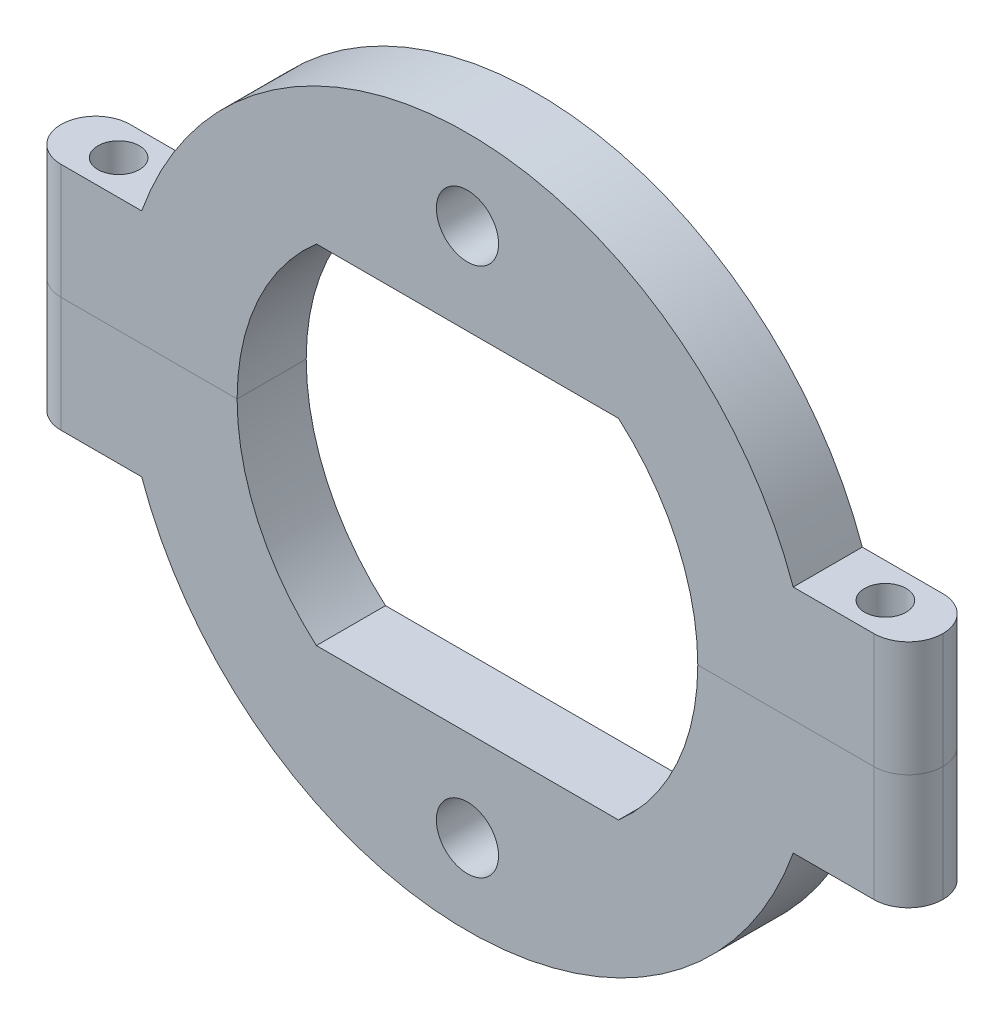
ISO-10303-21;
HEADER;
FILE_DESCRIPTION(('STEP AP214'),'2;1');
FILE_NAME('part.step','',(''),(''),'','','');
FILE_SCHEMA(('AUTOMOTIVE_DESIGN { 1 0 10303 214 1 1 1 1 }'));
ENDSEC;
DATA;
#1=APPLICATION_CONTEXT('core data for automotive mechanical design processes');
#2=APPLICATION_PROTOCOL_DEFINITION('international standard','automotive_design',2000,#1);
#3=PRODUCT_CONTEXT('',#1,'mechanical');
#4=PRODUCT('Part','Part','',(#3));
#5=PRODUCT_RELATED_PRODUCT_CATEGORY('part','',(#4));
#6=PRODUCT_DEFINITION_FORMATION('','',#4);
#7=PRODUCT_DEFINITION_CONTEXT('part definition',#1,'design');
#8=PRODUCT_DEFINITION('design','',#6,#7);
#9=PRODUCT_DEFINITION_SHAPE('','',#8);
#10=(LENGTH_UNIT() NAMED_UNIT(*) SI_UNIT(.MILLI.,.METRE.));
#11=(NAMED_UNIT(*) PLANE_ANGLE_UNIT() SI_UNIT($,.RADIAN.));
#12=(NAMED_UNIT(*) SI_UNIT($,.STERADIAN.) SOLID_ANGLE_UNIT());
#13=UNCERTAINTY_MEASURE_WITH_UNIT(LENGTH_MEASURE(1.E-05),#10,'distance_accuracy_value','');
#14=(GEOMETRIC_REPRESENTATION_CONTEXT(3) GLOBAL_UNCERTAINTY_ASSIGNED_CONTEXT((#13)) GLOBAL_UNIT_ASSIGNED_CONTEXT((#10,
#11,#12)) REPRESENTATION_CONTEXT('',''));
#15=CARTESIAN_POINT('',(0.,0.,0.));
#16=DIRECTION('',(0.,0.,1.));
#17=DIRECTION('',(1.,0.,0.));
#18=AXIS2_PLACEMENT_3D('',#15,#16,#17);
#19=CARTESIAN_POINT('',(0.,0.,0.));
#20=DIRECTION('',(0.,1.,0.));
#21=DIRECTION('',(0.,0.,1.));
#22=AXIS2_PLACEMENT_3D('',#19,#20,#21);
#23=PLANE('',#22);
#24=CARTESIAN_POINT('',(16.642135623731,0.,1.5));
#25=DIRECTION('',(0.,1.,0.));
#26=DIRECTION('',(0.,0.,1.));
#27=AXIS2_PLACEMENT_3D('',#24,#25,#26);
#28=CIRCLE('',#27,0.9);
#29=CARTESIAN_POINT('',(16.642135623731,0.,2.4));
#30=VERTEX_POINT('',#29);
#31=EDGE_CURVE('E174',#30,#30,#28,.F.);
#32=ORIENTED_EDGE('',*,*,#31,.T.);
#33=EDGE_LOOP('',(#32));
#34=FACE_BOUND('',#33,.T.);
#35=DIRECTION('',(0.,0.,-1.));
#36=VECTOR('',#35,1.);
#37=CARTESIAN_POINT('',(10.,0.,3.));
#38=LINE('',#37,#36);
#39=CARTESIAN_POINT('',(10.,0.,3.));
#40=VERTEX_POINT('',#39);
#41=CARTESIAN_POINT('',(10.,0.,0.));
#42=VERTEX_POINT('',#41);
#43=EDGE_CURVE('E162',#40,#42,#38,.T.);
#44=ORIENTED_EDGE('',*,*,#43,.F.);
#45=DIRECTION('',(-1.,0.,0.));
#46=VECTOR('',#45,1.);
#47=CARTESIAN_POINT('',(0.,0.,3.));
#48=LINE('',#47,#46);
#49=CARTESIAN_POINT('',(17.6421356237309,0.,3.));
#50=VERTEX_POINT('',#49);
#51=EDGE_CURVE('E228',#50,#40,#48,.T.);
#52=ORIENTED_EDGE('',*,*,#51,.F.);
#53=CARTESIAN_POINT('',(17.6421356237309,0.,1.5));
#54=DIRECTION('',(0.,1.,0.));
#55=DIRECTION('',(0.,0.,1.));
#56=AXIS2_PLACEMENT_3D('',#53,#54,#55);
#57=CIRCLE('',#56,1.5);
#58=CARTESIAN_POINT('',(19.142135623731,0.,1.5));
#59=VERTEX_POINT('',#58);
#60=EDGE_CURVE('E221',#59,#50,#57,.F.);
#61=ORIENTED_EDGE('',*,*,#60,.F.);
#62=CARTESIAN_POINT('',(17.6421356237309,0.,1.5));
#63=DIRECTION('',(0.,1.,0.));
#64=DIRECTION('',(0.,0.,1.));
#65=AXIS2_PLACEMENT_3D('',#62,#63,#64);
#66=CIRCLE('',#65,1.5);
#67=CARTESIAN_POINT('',(17.6421356237309,0.,0.));
#68=VERTEX_POINT('',#67);
#69=EDGE_CURVE('E170',#68,#59,#66,.F.);
#70=ORIENTED_EDGE('',*,*,#69,.F.);
#71=DIRECTION('',(-1.,0.,0.));
#72=VECTOR('',#71,1.);
#73=CARTESIAN_POINT('',(0.,0.,0.));
#74=LINE('',#73,#72);
#75=EDGE_CURVE('E155',#68,#42,#74,.T.);
#76=ORIENTED_EDGE('',*,*,#75,.T.);
#77=EDGE_LOOP('',(#44,#52,#61,#70,#76));
#78=FACE_BOUND('',#77,.T.);
#79=ADVANCED_FACE('F52',(#34,#78),#23,.T.);
#80=DIRECTION('',(0.,0.,-1.));
#81=VECTOR('',#80,1.);
#82=CARTESIAN_POINT('',(-10.,0.,3.));
#83=LINE('',#82,#81);
#84=CARTESIAN_POINT('',(-10.,0.,0.));
#85=VERTEX_POINT('',#84);
#86=CARTESIAN_POINT('',(-10.,0.,3.));
#87=VERTEX_POINT('',#86);
#88=EDGE_CURVE('E167',#85,#87,#83,.F.);
#89=ORIENTED_EDGE('',*,*,#88,.F.);
#90=CARTESIAN_POINT('',(-17.6421356237309,0.,0.));
#91=VERTEX_POINT('',#90);
#92=EDGE_CURVE('E171',#85,#91,#74,.T.);
#93=ORIENTED_EDGE('',*,*,#92,.T.);
#94=CARTESIAN_POINT('',(-17.6421356237309,0.,1.5));
#95=DIRECTION('',(0.,1.,0.));
#96=DIRECTION('',(0.,0.,1.));
#97=AXIS2_PLACEMENT_3D('',#94,#95,#96);
#98=CIRCLE('',#97,1.5);
#99=CARTESIAN_POINT('',(-19.142135623731,0.,1.5));
#100=VERTEX_POINT('',#99);
#101=EDGE_CURVE('E219',#100,#91,#98,.F.);
#102=ORIENTED_EDGE('',*,*,#101,.F.);
#103=CARTESIAN_POINT('',(-17.6421356237309,0.,1.5));
#104=DIRECTION('',(0.,1.,0.));
#105=DIRECTION('',(0.,0.,1.));
#106=AXIS2_PLACEMENT_3D('',#103,#104,#105);
#107=CIRCLE('',#106,1.5);
#108=CARTESIAN_POINT('',(-17.6421356237309,0.,3.));
#109=VERTEX_POINT('',#108);
#110=EDGE_CURVE('E216',#109,#100,#107,.F.);
#111=ORIENTED_EDGE('',*,*,#110,.F.);
#112=EDGE_CURVE('E227',#87,#109,#48,.T.);
#113=ORIENTED_EDGE('',*,*,#112,.F.);
#114=EDGE_LOOP('',(#89,#93,#102,#111,#113));
#115=FACE_BOUND('',#114,.T.);
#116=CARTESIAN_POINT('',(-16.642135623731,0.,1.5));
#117=DIRECTION('',(0.,1.,0.));
#118=DIRECTION('',(0.,0.,1.));
#119=AXIS2_PLACEMENT_3D('',#116,#117,#118);
#120=CIRCLE('',#119,0.9);
#121=CARTESIAN_POINT('',(-16.642135623731,0.,2.4));
#122=VERTEX_POINT('',#121);
#123=EDGE_CURVE('E224',#122,#122,#120,.T.);
#124=ORIENTED_EDGE('',*,*,#123,.F.);
#125=EDGE_LOOP('',(#124));
#126=FACE_BOUND('',#125,.T.);
#127=ADVANCED_FACE('F258',(#115,#126),#23,.T.);
#128=CARTESIAN_POINT('',(0.,0.,3.));
#129=DIRECTION('',(0.,0.,-1.));
#130=DIRECTION('',(-1.,0.,0.));
#131=AXIS2_PLACEMENT_3D('',#128,#129,#130);
#132=CYLINDRICAL_SURFACE('',#131,10.);
#133=CARTESIAN_POINT('',(0.,0.,3.));
#134=DIRECTION('',(0.,0.,1.));
#135=DIRECTION('',(1.,0.,0.));
#136=AXIS2_PLACEMENT_3D('',#133,#134,#135);
#137=CIRCLE('',#136,10.);
#138=CARTESIAN_POINT('',(6.55724789831832,-7.55,3.));
#139=VERTEX_POINT('',#138);
#140=EDGE_CURVE('E164',#139,#40,#137,.T.);
#141=ORIENTED_EDGE('',*,*,#140,.T.);
#142=ORIENTED_EDGE('',*,*,#43,.T.);
#143=CARTESIAN_POINT('',(0.,0.,0.));
#144=DIRECTION('',(0.,0.,1.));
#145=DIRECTION('',(1.,0.,0.));
#146=AXIS2_PLACEMENT_3D('',#143,#144,#145);
#147=CIRCLE('',#146,10.);
#148=CARTESIAN_POINT('',(6.55724789831832,-7.55,0.));
#149=VERTEX_POINT('',#148);
#150=EDGE_CURVE('E151',#149,#42,#147,.T.);
#151=ORIENTED_EDGE('',*,*,#150,.F.);
#152=DIRECTION('',(0.,0.,-1.));
#153=VECTOR('',#152,1.);
#154=CARTESIAN_POINT('',(6.55724789831832,-7.55,3.));
#155=LINE('',#154,#153);
#156=EDGE_CURVE('E69',#139,#149,#155,.T.);
#157=ORIENTED_EDGE('',*,*,#156,.F.);
#158=EDGE_LOOP('',(#141,#142,#151,#157));
#159=FACE_BOUND('',#158,.T.);
#160=ADVANCED_FACE('F163',(#159),#132,.F.);
#161=CARTESIAN_POINT('',(0.,-7.55,3.));
#162=DIRECTION('',(0.,1.,0.));
#163=DIRECTION('',(0.,0.,1.));
#164=AXIS2_PLACEMENT_3D('',#161,#162,#163);
#165=PLANE('',#164);
#166=DIRECTION('',(1.,0.,0.));
#167=VECTOR('',#166,1.);
#168=CARTESIAN_POINT('',(0.,-7.55,0.));
#169=LINE('',#168,#167);
#170=CARTESIAN_POINT('',(-6.55724789831832,-7.55,0.));
#171=VERTEX_POINT('',#170);
#172=EDGE_CURVE('E157',#171,#149,#169,.T.);
#173=ORIENTED_EDGE('',*,*,#172,.F.);
#174=DIRECTION('',(0.,0.,-1.));
#175=VECTOR('',#174,1.);
#176=CARTESIAN_POINT('',(-6.55724789831832,-7.55,3.));
#177=LINE('',#176,#175);
#178=CARTESIAN_POINT('',(-6.55724789831832,-7.55,3.));
#179=VERTEX_POINT('',#178);
#180=EDGE_CURVE('E314',#179,#171,#177,.T.);
#181=ORIENTED_EDGE('',*,*,#180,.F.);
#182=DIRECTION('',(1.,0.,0.));
#183=VECTOR('',#182,1.);
#184=CARTESIAN_POINT('',(0.,-7.55,3.));
#185=LINE('',#184,#183);
#186=EDGE_CURVE('E197',#179,#139,#185,.T.);
#187=ORIENTED_EDGE('',*,*,#186,.T.);
#188=ORIENTED_EDGE('',*,*,#156,.T.);
#189=EDGE_LOOP('',(#173,#181,#187,#188));
#190=FACE_BOUND('',#189,.T.);
#191=ADVANCED_FACE('F265',(#190),#165,.T.);
#192=EDGE_CURVE('E160',#85,#171,#147,.T.);
#193=ORIENTED_EDGE('',*,*,#192,.F.);
#194=ORIENTED_EDGE('',*,*,#88,.T.);
#195=EDGE_CURVE('E88',#87,#179,#137,.T.);
#196=ORIENTED_EDGE('',*,*,#195,.T.);
#197=ORIENTED_EDGE('',*,*,#180,.T.);
#198=EDGE_LOOP('',(#193,#194,#196,#197));
#199=FACE_BOUND('',#198,.T.);
#200=ADVANCED_FACE('F230',(#199),#132,.F.);
#201=CARTESIAN_POINT('',(0.,0.,3.));
#202=DIRECTION('',(0.,0.,-1.));
#203=DIRECTION('',(-1.,0.,0.));
#204=AXIS2_PLACEMENT_3D('',#201,#202,#203);
#205=CYLINDRICAL_SURFACE('',#204,15.);
#206=CARTESIAN_POINT('',(0.,0.,0.));
#207=DIRECTION('',(0.,0.,1.));
#208=DIRECTION('',(1.,0.,0.));
#209=AXIS2_PLACEMENT_3D('',#206,#207,#208);
#210=CIRCLE('',#209,15.);
#211=CARTESIAN_POINT('',(-14.142135623731,-5.,0.));
#212=VERTEX_POINT('',#211);
#213=CARTESIAN_POINT('',(14.1421356237309,-5.,0.));
#214=VERTEX_POINT('',#213);
#215=EDGE_CURVE('E198',#212,#214,#210,.T.);
#216=ORIENTED_EDGE('',*,*,#215,.T.);
#217=DIRECTION('',(0.,0.,-1.));
#218=VECTOR('',#217,1.);
#219=CARTESIAN_POINT('',(14.1421356237309,-5.,3.));
#220=LINE('',#219,#218);
#221=CARTESIAN_POINT('',(14.1421356237309,-5.,3.));
#222=VERTEX_POINT('',#221);
#223=EDGE_CURVE('E312',#222,#214,#220,.T.);
#224=ORIENTED_EDGE('',*,*,#223,.F.);
#225=CARTESIAN_POINT('',(0.,0.,3.));
#226=DIRECTION('',(0.,0.,1.));
#227=DIRECTION('',(1.,0.,0.));
#228=AXIS2_PLACEMENT_3D('',#225,#226,#227);
#229=CIRCLE('',#228,15.);
#230=CARTESIAN_POINT('',(-14.142135623731,-5.,3.));
#231=VERTEX_POINT('',#230);
#232=EDGE_CURVE('E191',#231,#222,#229,.T.);
#233=ORIENTED_EDGE('',*,*,#232,.F.);
#234=DIRECTION('',(0.,0.,-1.));
#235=VECTOR('',#234,1.);
#236=CARTESIAN_POINT('',(-14.142135623731,-5.,3.));
#237=LINE('',#236,#235);
#238=EDGE_CURVE('E99',#231,#212,#237,.T.);
#239=ORIENTED_EDGE('',*,*,#238,.T.);
#240=EDGE_LOOP('',(#216,#224,#233,#239));
#241=FACE_BOUND('',#240,.T.);
#242=ADVANCED_FACE('F272',(#241),#205,.T.);
#243=CARTESIAN_POINT('',(0.,-11.5,0.));
#244=DIRECTION('',(0.,0.,1.));
#245=DIRECTION('',(1.,0.,0.));
#246=AXIS2_PLACEMENT_3D('',#243,#244,#245);
#247=CYLINDRICAL_SURFACE('',#246,1.35);
#248=CARTESIAN_POINT('',(0.,-11.5,0.));
#249=DIRECTION('',(0.,0.,1.));
#250=DIRECTION('',(-1.,0.,0.));
#251=AXIS2_PLACEMENT_3D('',#248,#249,#250);
#252=CIRCLE('',#251,1.35);
#253=CARTESIAN_POINT('',(-1.35,-11.5,0.));
#254=VERTEX_POINT('',#253);
#255=EDGE_CURVE('E201',#254,#254,#252,.T.);
#256=ORIENTED_EDGE('',*,*,#255,.F.);
#257=EDGE_LOOP('',(#256));
#258=FACE_BOUND('',#257,.T.);
#259=CARTESIAN_POINT('',(0.,-11.5,3.));
#260=DIRECTION('',(0.,0.,1.));
#261=DIRECTION('',(-1.,0.,0.));
#262=AXIS2_PLACEMENT_3D('',#259,#260,#261);
#263=CIRCLE('',#262,1.35);
#264=CARTESIAN_POINT('',(-1.35,-11.5,3.));
#265=VERTEX_POINT('',#264);
#266=EDGE_CURVE('E206',#265,#265,#263,.T.);
#267=ORIENTED_EDGE('',*,*,#266,.T.);
#268=EDGE_LOOP('',(#267));
#269=FACE_BOUND('',#268,.T.);
#270=ADVANCED_FACE('F270',(#258,#269),#247,.F.);
#271=CARTESIAN_POINT('',(0.,-5.,3.));
#272=DIRECTION('',(0.,1.,0.));
#273=DIRECTION('',(0.,0.,1.));
#274=AXIS2_PLACEMENT_3D('',#271,#272,#273);
#275=PLANE('',#274);
#276=CARTESIAN_POINT('',(16.642135623731,-5.,1.5));
#277=DIRECTION('',(0.,-1.,0.));
#278=DIRECTION('',(1.,0.,0.));
#279=AXIS2_PLACEMENT_3D('',#276,#277,#278);
#280=CIRCLE('',#279,0.9);
#281=CARTESIAN_POINT('',(17.542135623731,-5.,1.5));
#282=VERTEX_POINT('',#281);
#283=EDGE_CURVE('E158',#282,#282,#280,.T.);
#284=ORIENTED_EDGE('',*,*,#283,.F.);
#285=EDGE_LOOP('',(#284));
#286=FACE_BOUND('',#285,.T.);
#287=CARTESIAN_POINT('',(17.6421356237309,-5.,1.5));
#288=DIRECTION('',(0.,1.,0.));
#289=DIRECTION('',(0.,0.,1.));
#290=AXIS2_PLACEMENT_3D('',#287,#288,#289);
#291=CIRCLE('',#290,1.5);
#292=CARTESIAN_POINT('',(17.6421356237309,-5.,0.));
#293=VERTEX_POINT('',#292);
#294=CARTESIAN_POINT('',(19.142135623731,-5.,1.5));
#295=VERTEX_POINT('',#294);
#296=EDGE_CURVE('E310',#293,#295,#291,.F.);
#297=ORIENTED_EDGE('',*,*,#296,.T.);
#298=CARTESIAN_POINT('',(17.6421356237309,-5.,1.5));
#299=DIRECTION('',(0.,1.,0.));
#300=DIRECTION('',(0.,0.,1.));
#301=AXIS2_PLACEMENT_3D('',#298,#299,#300);
#302=CIRCLE('',#301,1.5);
#303=CARTESIAN_POINT('',(17.6421356237309,-5.,3.));
#304=VERTEX_POINT('',#303);
#305=EDGE_CURVE('E190',#295,#304,#302,.F.);
#306=ORIENTED_EDGE('',*,*,#305,.T.);
#307=DIRECTION('',(1.,0.,0.));
#308=VECTOR('',#307,1.);
#309=CARTESIAN_POINT('',(0.,-5.,3.));
#310=LINE('',#309,#308);
#311=EDGE_CURVE('E194',#222,#304,#310,.T.);
#312=ORIENTED_EDGE('',*,*,#311,.F.);
#313=ORIENTED_EDGE('',*,*,#223,.T.);
#314=DIRECTION('',(1.,0.,0.));
#315=VECTOR('',#314,1.);
#316=CARTESIAN_POINT('',(0.,-5.,0.));
#317=LINE('',#316,#315);
#318=EDGE_CURVE('E199',#214,#293,#317,.T.);
#319=ORIENTED_EDGE('',*,*,#318,.T.);
#320=EDGE_LOOP('',(#297,#306,#312,#313,#319));
#321=FACE_BOUND('',#320,.T.);
#322=ADVANCED_FACE('F281',(#286,#321),#275,.F.);
#323=CARTESIAN_POINT('',(0.,0.,0.));
#324=DIRECTION('',(0.,0.,1.));
#325=DIRECTION('',(1.,0.,0.));
#326=AXIS2_PLACEMENT_3D('',#323,#324,#325);
#327=PLANE('',#326);
#328=ORIENTED_EDGE('',*,*,#255,.T.);
#329=EDGE_LOOP('',(#328));
#330=FACE_BOUND('',#329,.T.);
#331=ORIENTED_EDGE('',*,*,#75,.F.);
#332=DIRECTION('',(0.,-1.,0.));
#333=VECTOR('',#332,1.);
#334=CARTESIAN_POINT('',(17.6421356237309,-5.,0.));
#335=LINE('',#334,#333);
#336=EDGE_CURVE('E179',#68,#293,#335,.T.);
#337=ORIENTED_EDGE('',*,*,#336,.T.);
#338=ORIENTED_EDGE('',*,*,#318,.F.);
#339=ORIENTED_EDGE('',*,*,#215,.F.);
#340=DIRECTION('',(-1.,0.,0.));
#341=VECTOR('',#340,1.);
#342=CARTESIAN_POINT('',(0.,-5.,0.));
#343=LINE('',#342,#341);
#344=CARTESIAN_POINT('',(-17.6421356237309,-5.,0.));
#345=VERTEX_POINT('',#344);
#346=EDGE_CURVE('E196',#212,#345,#343,.T.);
#347=ORIENTED_EDGE('',*,*,#346,.T.);
#348=DIRECTION('',(0.,-1.,0.));
#349=VECTOR('',#348,1.);
#350=CARTESIAN_POINT('',(-17.6421356237309,0.,0.));
#351=LINE('',#350,#349);
#352=EDGE_CURVE('E181',#345,#91,#351,.F.);
#353=ORIENTED_EDGE('',*,*,#352,.T.);
#354=ORIENTED_EDGE('',*,*,#92,.F.);
#355=ORIENTED_EDGE('',*,*,#192,.T.);
#356=ORIENTED_EDGE('',*,*,#172,.T.);
#357=ORIENTED_EDGE('',*,*,#150,.T.);
#358=EDGE_LOOP('',(#331,#337,#338,#339,#347,#353,#354,#355,#356,#357));
#359=FACE_BOUND('',#358,.T.);
#360=ADVANCED_FACE('F153',(#330,#359),#327,.F.);
#361=CARTESIAN_POINT('',(0.,-5.,3.));
#362=DIRECTION('',(0.,-1.,0.));
#363=DIRECTION('',(0.,0.,-1.));
#364=AXIS2_PLACEMENT_3D('',#361,#362,#363);
#365=PLANE('',#364);
#366=CARTESIAN_POINT('',(-16.642135623731,-5.,1.5));
#367=DIRECTION('',(0.,1.,0.));
#368=DIRECTION('',(-1.,0.,0.));
#369=AXIS2_PLACEMENT_3D('',#366,#367,#368);
#370=CIRCLE('',#369,0.9);
#371=CARTESIAN_POINT('',(-17.542135623731,-5.,1.5));
#372=VERTEX_POINT('',#371);
#373=EDGE_CURVE('E211',#372,#372,#370,.T.);
#374=ORIENTED_EDGE('',*,*,#373,.T.);
#375=EDGE_LOOP('',(#374));
#376=FACE_BOUND('',#375,.T.);
#377=DIRECTION('',(-1.,0.,0.));
#378=VECTOR('',#377,1.);
#379=CARTESIAN_POINT('',(0.,-5.,3.));
#380=LINE('',#379,#378);
#381=CARTESIAN_POINT('',(-17.6421356237309,-5.,3.));
#382=VERTEX_POINT('',#381);
#383=EDGE_CURVE('E305',#231,#382,#380,.T.);
#384=ORIENTED_EDGE('',*,*,#383,.T.);
#385=CARTESIAN_POINT('',(-17.6421356237309,-5.,1.5));
#386=DIRECTION('',(0.,-1.,0.));
#387=DIRECTION('',(0.,0.,-1.));
#388=AXIS2_PLACEMENT_3D('',#385,#386,#387);
#389=CIRCLE('',#388,1.5);
#390=CARTESIAN_POINT('',(-19.142135623731,-5.,1.5));
#391=VERTEX_POINT('',#390);
#392=EDGE_CURVE('E218',#382,#391,#389,.T.);
#393=ORIENTED_EDGE('',*,*,#392,.T.);
#394=CARTESIAN_POINT('',(-17.6421356237309,-5.,1.5));
#395=DIRECTION('',(0.,-1.,0.));
#396=DIRECTION('',(0.,0.,-1.));
#397=AXIS2_PLACEMENT_3D('',#394,#395,#396);
#398=CIRCLE('',#397,1.5);
#399=EDGE_CURVE('E182',#391,#345,#398,.T.);
#400=ORIENTED_EDGE('',*,*,#399,.T.);
#401=ORIENTED_EDGE('',*,*,#346,.F.);
#402=ORIENTED_EDGE('',*,*,#238,.F.);
#403=EDGE_LOOP('',(#384,#393,#400,#401,#402));
#404=FACE_BOUND('',#403,.T.);
#405=ADVANCED_FACE('F247',(#376,#404),#365,.T.);
#406=CARTESIAN_POINT('',(-17.6421356237309,0.,1.5));
#407=DIRECTION('',(0.,-1.,0.));
#408=DIRECTION('',(0.,0.,-1.));
#409=AXIS2_PLACEMENT_3D('',#406,#407,#408);
#410=CYLINDRICAL_SURFACE('',#409,1.5);
#411=DIRECTION('',(0.,-1.,0.));
#412=VECTOR('',#411,1.);
#413=CARTESIAN_POINT('',(-19.142135623731,0.,1.5));
#414=LINE('',#413,#412);
#415=EDGE_CURVE('E13',#100,#391,#414,.T.);
#416=ORIENTED_EDGE('',*,*,#415,.F.);
#417=ORIENTED_EDGE('',*,*,#101,.T.);
#418=ORIENTED_EDGE('',*,*,#352,.F.);
#419=ORIENTED_EDGE('',*,*,#399,.F.);
#420=EDGE_LOOP('',(#416,#417,#418,#419));
#421=FACE_BOUND('',#420,.T.);
#422=ADVANCED_FACE('F277',(#421),#410,.T.);
#423=CARTESIAN_POINT('',(0.,0.,3.));
#424=DIRECTION('',(0.,0.,1.));
#425=DIRECTION('',(1.,0.,0.));
#426=AXIS2_PLACEMENT_3D('',#423,#424,#425);
#427=PLANE('',#426);
#428=ORIENTED_EDGE('',*,*,#266,.F.);
#429=EDGE_LOOP('',(#428));
#430=FACE_BOUND('',#429,.T.);
#431=DIRECTION('',(0.,-1.,0.));
#432=VECTOR('',#431,1.);
#433=CARTESIAN_POINT('',(17.6421356237309,0.,3.));
#434=LINE('',#433,#432);
#435=EDGE_CURVE('E185',#304,#50,#434,.F.);
#436=ORIENTED_EDGE('',*,*,#435,.T.);
#437=ORIENTED_EDGE('',*,*,#51,.T.);
#438=ORIENTED_EDGE('',*,*,#140,.F.);
#439=ORIENTED_EDGE('',*,*,#186,.F.);
#440=ORIENTED_EDGE('',*,*,#195,.F.);
#441=ORIENTED_EDGE('',*,*,#112,.T.);
#442=DIRECTION('',(0.,-1.,0.));
#443=VECTOR('',#442,1.);
#444=CARTESIAN_POINT('',(-17.6421356237309,-5.,3.));
#445=LINE('',#444,#443);
#446=EDGE_CURVE('E188',#109,#382,#445,.T.);
#447=ORIENTED_EDGE('',*,*,#446,.T.);
#448=ORIENTED_EDGE('',*,*,#383,.F.);
#449=ORIENTED_EDGE('',*,*,#232,.T.);
#450=ORIENTED_EDGE('',*,*,#311,.T.);
#451=EDGE_LOOP('',(#436,#437,#438,#439,#440,#441,#447,#448,#449,#450));
#452=FACE_BOUND('',#451,.T.);
#453=ADVANCED_FACE('F236',(#430,#452),#427,.T.);
#454=CARTESIAN_POINT('',(-17.6421356237309,0.,1.5));
#455=DIRECTION('',(0.,1.,0.));
#456=DIRECTION('',(0.,0.,1.));
#457=AXIS2_PLACEMENT_3D('',#454,#455,#456);
#458=CYLINDRICAL_SURFACE('',#457,1.5);
#459=ORIENTED_EDGE('',*,*,#446,.F.);
#460=ORIENTED_EDGE('',*,*,#110,.T.);
#461=ORIENTED_EDGE('',*,*,#415,.T.);
#462=ORIENTED_EDGE('',*,*,#392,.F.);
#463=EDGE_LOOP('',(#459,#460,#461,#462));
#464=FACE_BOUND('',#463,.T.);
#465=ADVANCED_FACE('F54',(#464),#458,.T.);
#466=CARTESIAN_POINT('',(17.6421356237309,0.,1.5));
#467=DIRECTION('',(0.,1.,0.));
#468=DIRECTION('',(0.,0.,1.));
#469=AXIS2_PLACEMENT_3D('',#466,#467,#468);
#470=CYLINDRICAL_SURFACE('',#469,1.5);
#471=ORIENTED_EDGE('',*,*,#336,.F.);
#472=ORIENTED_EDGE('',*,*,#69,.T.);
#473=DIRECTION('',(0.,-1.,0.));
#474=VECTOR('',#473,1.);
#475=CARTESIAN_POINT('',(19.142135623731,5.,1.5));
#476=LINE('',#475,#474);
#477=EDGE_CURVE('E61',#295,#59,#476,.F.);
#478=ORIENTED_EDGE('',*,*,#477,.F.);
#479=ORIENTED_EDGE('',*,*,#296,.F.);
#480=EDGE_LOOP('',(#471,#472,#478,#479));
#481=FACE_BOUND('',#480,.T.);
#482=ADVANCED_FACE('F284',(#481),#470,.T.);
#483=CARTESIAN_POINT('',(17.6421356237309,0.,1.5));
#484=DIRECTION('',(0.,-1.,0.));
#485=DIRECTION('',(0.,0.,-1.));
#486=AXIS2_PLACEMENT_3D('',#483,#484,#485);
#487=CYLINDRICAL_SURFACE('',#486,1.5);
#488=ORIENTED_EDGE('',*,*,#477,.T.);
#489=ORIENTED_EDGE('',*,*,#60,.T.);
#490=ORIENTED_EDGE('',*,*,#435,.F.);
#491=ORIENTED_EDGE('',*,*,#305,.F.);
#492=EDGE_LOOP('',(#488,#489,#490,#491));
#493=FACE_BOUND('',#492,.T.);
#494=ADVANCED_FACE('F254',(#493),#487,.T.);
#495=CARTESIAN_POINT('',(-16.6421356237309,15.,1.5));
#496=DIRECTION('',(0.,-1.,0.));
#497=DIRECTION('',(1.,0.,0.));
#498=AXIS2_PLACEMENT_3D('',#495,#496,#497);
#499=CYLINDRICAL_SURFACE('',#498,0.9);
#500=ORIENTED_EDGE('',*,*,#373,.F.);
#501=EDGE_LOOP('',(#500));
#502=FACE_BOUND('',#501,.T.);
#503=ORIENTED_EDGE('',*,*,#123,.T.);
#504=EDGE_LOOP('',(#503));
#505=FACE_BOUND('',#504,.T.);
#506=ADVANCED_FACE('F250',(#502,#505),#499,.F.);
#507=CARTESIAN_POINT('',(16.6421356237309,15.,1.5));
#508=DIRECTION('',(0.,-1.,0.));
#509=DIRECTION('',(1.,0.,0.));
#510=AXIS2_PLACEMENT_3D('',#507,#508,#509);
#511=CYLINDRICAL_SURFACE('',#510,0.9);
#512=ORIENTED_EDGE('',*,*,#283,.T.);
#513=EDGE_LOOP('',(#512));
#514=FACE_BOUND('',#513,.T.);
#515=ORIENTED_EDGE('',*,*,#31,.F.);
#516=EDGE_LOOP('',(#515));
#517=FACE_BOUND('',#516,.T.);
#518=ADVANCED_FACE('F253',(#514,#517),#511,.F.);
#519=CLOSED_SHELL('',(#79,#127,#160,#191,#200,#242,#270,#322,#360,#405,#422,#453,#465,#482,#494,
#506,#518));
#520=MANIFOLD_SOLID_BREP('B2',#519);
#521=CARTESIAN_POINT('',(0.,0.,0.));
#522=DIRECTION('',(0.,1.,0.));
#523=DIRECTION('',(0.,0.,1.));
#524=AXIS2_PLACEMENT_3D('',#521,#522,#523);
#525=PLANE('',#524);
#526=DIRECTION('',(0.,0.,-1.));
#527=VECTOR('',#526,1.);
#528=CARTESIAN_POINT('',(10.,0.,3.));
#529=LINE('',#528,#527);
#530=CARTESIAN_POINT('',(10.,0.,3.));
#531=VERTEX_POINT('',#530);
#532=CARTESIAN_POINT('',(10.,0.,0.));
#533=VERTEX_POINT('',#532);
#534=EDGE_CURVE('E708',#531,#533,#529,.T.);
#535=ORIENTED_EDGE('',*,*,#534,.T.);
#536=DIRECTION('',(-1.,0.,0.));
#537=VECTOR('',#536,1.);
#538=CARTESIAN_POINT('',(0.,0.,0.));
#539=LINE('',#538,#537);
#540=CARTESIAN_POINT('',(17.6421356237309,0.,0.));
#541=VERTEX_POINT('',#540);
#542=EDGE_CURVE('E706',#541,#533,#539,.T.);
#543=ORIENTED_EDGE('',*,*,#542,.F.);
#544=CARTESIAN_POINT('',(17.6421356237309,0.,1.5));
#545=DIRECTION('',(0.,1.,0.));
#546=DIRECTION('',(0.,0.,1.));
#547=AXIS2_PLACEMENT_3D('',#544,#545,#546);
#548=CIRCLE('',#547,1.5);
#549=CARTESIAN_POINT('',(19.142135623731,0.,1.5));
#550=VERTEX_POINT('',#549);
#551=EDGE_CURVE('E717',#541,#550,#548,.F.);
#552=ORIENTED_EDGE('',*,*,#551,.T.);
#553=CARTESIAN_POINT('',(17.6421356237309,0.,1.5));
#554=DIRECTION('',(0.,1.,0.));
#555=DIRECTION('',(0.,0.,1.));
#556=AXIS2_PLACEMENT_3D('',#553,#554,#555);
#557=CIRCLE('',#556,1.5);
#558=CARTESIAN_POINT('',(17.6421356237309,0.,3.));
#559=VERTEX_POINT('',#558);
#560=EDGE_CURVE('E705',#550,#559,#557,.F.);
#561=ORIENTED_EDGE('',*,*,#560,.T.);
#562=DIRECTION('',(-1.,0.,0.));
#563=VECTOR('',#562,1.);
#564=CARTESIAN_POINT('',(0.,0.,3.));
#565=LINE('',#564,#563);
#566=EDGE_CURVE('E712',#559,#531,#565,.T.);
#567=ORIENTED_EDGE('',*,*,#566,.T.);
#568=EDGE_LOOP('',(#535,#543,#552,#561,#567));
#569=FACE_BOUND('',#568,.T.);
#570=CARTESIAN_POINT('',(16.642135623731,0.,1.5));
#571=DIRECTION('',(0.,1.,0.));
#572=DIRECTION('',(0.,0.,1.));
#573=AXIS2_PLACEMENT_3D('',#570,#571,#572);
#574=CIRCLE('',#573,0.9);
#575=CARTESIAN_POINT('',(16.642135623731,0.,2.4));
#576=VERTEX_POINT('',#575);
#577=EDGE_CURVE('E533',#576,#576,#574,.F.);
#578=ORIENTED_EDGE('',*,*,#577,.F.);
#579=EDGE_LOOP('',(#578));
#580=FACE_BOUND('',#579,.T.);
#581=ADVANCED_FACE('F529',(#569,#580),#525,.F.);
#582=CARTESIAN_POINT('',(-16.642135623731,0.,1.5));
#583=DIRECTION('',(0.,1.,0.));
#584=DIRECTION('',(0.,0.,1.));
#585=AXIS2_PLACEMENT_3D('',#582,#583,#584);
#586=CIRCLE('',#585,0.9);
#587=CARTESIAN_POINT('',(-16.642135623731,0.,2.4));
#588=VERTEX_POINT('',#587);
#589=EDGE_CURVE('E711',#588,#588,#586,.T.);
#590=ORIENTED_EDGE('',*,*,#589,.T.);
#591=EDGE_LOOP('',(#590));
#592=FACE_BOUND('',#591,.T.);
#593=DIRECTION('',(0.,0.,-1.));
#594=VECTOR('',#593,1.);
#595=CARTESIAN_POINT('',(-10.,0.,3.));
#596=LINE('',#595,#594);
#597=CARTESIAN_POINT('',(-10.,0.,0.));
#598=VERTEX_POINT('',#597);
#599=CARTESIAN_POINT('',(-10.,0.,3.));
#600=VERTEX_POINT('',#599);
#601=EDGE_CURVE('E713',#598,#600,#596,.F.);
#602=ORIENTED_EDGE('',*,*,#601,.T.);
#603=CARTESIAN_POINT('',(-17.6421356237309,0.,3.));
#604=VERTEX_POINT('',#603);
#605=EDGE_CURVE('E646',#600,#604,#565,.T.);
#606=ORIENTED_EDGE('',*,*,#605,.T.);
#607=CARTESIAN_POINT('',(-17.6421356237309,0.,1.5));
#608=DIRECTION('',(0.,1.,0.));
#609=DIRECTION('',(0.,0.,1.));
#610=AXIS2_PLACEMENT_3D('',#607,#608,#609);
#611=CIRCLE('',#610,1.5);
#612=CARTESIAN_POINT('',(-19.142135623731,0.,1.5));
#613=VERTEX_POINT('',#612);
#614=EDGE_CURVE('E50',#604,#613,#611,.F.);
#615=ORIENTED_EDGE('',*,*,#614,.T.);
#616=CARTESIAN_POINT('',(-17.6421356237309,0.,1.5));
#617=DIRECTION('',(0.,1.,0.));
#618=DIRECTION('',(0.,0.,1.));
#619=AXIS2_PLACEMENT_3D('',#616,#617,#618);
#620=CIRCLE('',#619,1.5);
#621=CARTESIAN_POINT('',(-17.6421356237309,0.,0.));
#622=VERTEX_POINT('',#621);
#623=EDGE_CURVE('E538',#613,#622,#620,.F.);
#624=ORIENTED_EDGE('',*,*,#623,.T.);
#625=EDGE_CURVE('E709',#598,#622,#539,.T.);
#626=ORIENTED_EDGE('',*,*,#625,.F.);
#627=EDGE_LOOP('',(#602,#606,#615,#624,#626));
#628=FACE_BOUND('',#627,.T.);
#629=ADVANCED_FACE('F531',(#592,#628),#525,.F.);
#630=CARTESIAN_POINT('',(0.,5.,3.));
#631=DIRECTION('',(0.,1.,0.));
#632=DIRECTION('',(0.,0.,1.));
#633=AXIS2_PLACEMENT_3D('',#630,#631,#632);
#634=PLANE('',#633);
#635=CARTESIAN_POINT('',(16.6421356237309,5.,1.5));
#636=DIRECTION('',(0.,1.,0.));
#637=DIRECTION('',(0.,0.,1.));
#638=AXIS2_PLACEMENT_3D('',#635,#636,#637);
#639=CIRCLE('',#638,0.9);
#640=CARTESIAN_POINT('',(16.6421356237309,5.,2.4));
#641=VERTEX_POINT('',#640);
#642=EDGE_CURVE('E664',#641,#641,#639,.T.);
#643=ORIENTED_EDGE('',*,*,#642,.F.);
#644=EDGE_LOOP('',(#643));
#645=FACE_BOUND('',#644,.T.);
#646=DIRECTION('',(1.,0.,0.));
#647=VECTOR('',#646,1.);
#648=CARTESIAN_POINT('',(0.,5.,3.));
#649=LINE('',#648,#647);
#650=CARTESIAN_POINT('',(14.142135623731,5.,3.));
#651=VERTEX_POINT('',#650);
#652=CARTESIAN_POINT('',(17.6421356237309,5.,3.));
#653=VERTEX_POINT('',#652);
#654=EDGE_CURVE('E641',#651,#653,#649,.T.);
#655=ORIENTED_EDGE('',*,*,#654,.T.);
#656=CARTESIAN_POINT('',(17.6421356237309,5.,1.5));
#657=DIRECTION('',(0.,1.,0.));
#658=DIRECTION('',(0.,0.,1.));
#659=AXIS2_PLACEMENT_3D('',#656,#657,#658);
#660=CIRCLE('',#659,1.5);
#661=CARTESIAN_POINT('',(19.142135623731,5.,1.5));
#662=VERTEX_POINT('',#661);
#663=EDGE_CURVE('E687',#653,#662,#660,.T.);
#664=ORIENTED_EDGE('',*,*,#663,.T.);
#665=CARTESIAN_POINT('',(17.6421356237309,5.,1.5));
#666=DIRECTION('',(0.,1.,0.));
#667=DIRECTION('',(0.,0.,1.));
#668=AXIS2_PLACEMENT_3D('',#665,#666,#667);
#669=CIRCLE('',#668,1.5);
#670=CARTESIAN_POINT('',(17.6421356237309,5.,0.));
#671=VERTEX_POINT('',#670);
#672=EDGE_CURVE('E685',#662,#671,#669,.T.);
#673=ORIENTED_EDGE('',*,*,#672,.T.);
#674=DIRECTION('',(1.,0.,0.));
#675=VECTOR('',#674,1.);
#676=CARTESIAN_POINT('',(0.,5.,0.));
#677=LINE('',#676,#675);
#678=CARTESIAN_POINT('',(14.142135623731,5.,0.));
#679=VERTEX_POINT('',#678);
#680=EDGE_CURVE('E667',#679,#671,#677,.T.);
#681=ORIENTED_EDGE('',*,*,#680,.F.);
#682=DIRECTION('',(0.,0.,-1.));
#683=VECTOR('',#682,1.);
#684=CARTESIAN_POINT('',(14.142135623731,5.,3.));
#685=LINE('',#684,#683);
#686=EDGE_CURVE('E676',#651,#679,#685,.T.);
#687=ORIENTED_EDGE('',*,*,#686,.F.);
#688=EDGE_LOOP('',(#655,#664,#673,#681,#687));
#689=FACE_BOUND('',#688,.T.);
#690=ADVANCED_FACE('F758',(#645,#689),#634,.T.);
#691=CARTESIAN_POINT('',(0.,0.,3.));
#692=DIRECTION('',(0.,0.,-1.));
#693=DIRECTION('',(-1.,0.,0.));
#694=AXIS2_PLACEMENT_3D('',#691,#692,#693);
#695=CYLINDRICAL_SURFACE('',#694,15.);
#696=CARTESIAN_POINT('',(0.,0.,0.));
#697=DIRECTION('',(0.,0.,1.));
#698=DIRECTION('',(1.,0.,0.));
#699=AXIS2_PLACEMENT_3D('',#696,#697,#698);
#700=CIRCLE('',#699,15.);
#701=CARTESIAN_POINT('',(-14.142135623731,5.,0.));
#702=VERTEX_POINT('',#701);
#703=EDGE_CURVE('E668',#679,#702,#700,.T.);
#704=ORIENTED_EDGE('',*,*,#703,.T.);
#705=DIRECTION('',(0.,0.,-1.));
#706=VECTOR('',#705,1.);
#707=CARTESIAN_POINT('',(-14.142135623731,5.,3.));
#708=LINE('',#707,#706);
#709=CARTESIAN_POINT('',(-14.142135623731,5.,3.));
#710=VERTEX_POINT('',#709);
#711=EDGE_CURVE('E631',#710,#702,#708,.T.);
#712=ORIENTED_EDGE('',*,*,#711,.F.);
#713=CARTESIAN_POINT('',(0.,0.,3.));
#714=DIRECTION('',(0.,0.,1.));
#715=DIRECTION('',(1.,0.,0.));
#716=AXIS2_PLACEMENT_3D('',#713,#714,#715);
#717=CIRCLE('',#716,15.);
#718=EDGE_CURVE('E655',#651,#710,#717,.T.);
#719=ORIENTED_EDGE('',*,*,#718,.F.);
#720=ORIENTED_EDGE('',*,*,#686,.T.);
#721=EDGE_LOOP('',(#704,#712,#719,#720));
#722=FACE_BOUND('',#721,.T.);
#723=ADVANCED_FACE('F799',(#722),#695,.T.);
#724=CARTESIAN_POINT('',(0.,5.,3.));
#725=DIRECTION('',(0.,-1.,0.));
#726=DIRECTION('',(0.,0.,-1.));
#727=AXIS2_PLACEMENT_3D('',#724,#725,#726);
#728=PLANE('',#727);
#729=CARTESIAN_POINT('',(-16.6421356237309,5.,1.5));
#730=DIRECTION('',(0.,-1.,0.));
#731=DIRECTION('',(0.,0.,-1.));
#732=AXIS2_PLACEMENT_3D('',#729,#730,#731);
#733=CIRCLE('',#732,0.9);
#734=CARTESIAN_POINT('',(-16.6421356237309,5.,0.6));
#735=VERTEX_POINT('',#734);
#736=EDGE_CURVE('E652',#735,#735,#733,.F.);
#737=ORIENTED_EDGE('',*,*,#736,.F.);
#738=EDGE_LOOP('',(#737));
#739=FACE_BOUND('',#738,.T.);
#740=CARTESIAN_POINT('',(-17.6421356237309,5.,1.5));
#741=DIRECTION('',(0.,-1.,0.));
#742=DIRECTION('',(0.,0.,-1.));
#743=AXIS2_PLACEMENT_3D('',#740,#741,#742);
#744=CIRCLE('',#743,1.5);
#745=CARTESIAN_POINT('',(-17.6421356237309,5.,0.));
#746=VERTEX_POINT('',#745);
#747=CARTESIAN_POINT('',(-19.142135623731,5.,1.5));
#748=VERTEX_POINT('',#747);
#749=EDGE_CURVE('E695',#746,#748,#744,.F.);
#750=ORIENTED_EDGE('',*,*,#749,.T.);
#751=CARTESIAN_POINT('',(-17.6421356237309,5.,1.5));
#752=DIRECTION('',(0.,-1.,0.));
#753=DIRECTION('',(0.,0.,-1.));
#754=AXIS2_PLACEMENT_3D('',#751,#752,#753);
#755=CIRCLE('',#754,1.5);
#756=CARTESIAN_POINT('',(-17.6421356237309,5.,3.));
#757=VERTEX_POINT('',#756);
#758=EDGE_CURVE('E697',#748,#757,#755,.F.);
#759=ORIENTED_EDGE('',*,*,#758,.T.);
#760=DIRECTION('',(-1.,0.,0.));
#761=VECTOR('',#760,1.);
#762=CARTESIAN_POINT('',(0.,5.,3.));
#763=LINE('',#762,#761);
#764=EDGE_CURVE('E657',#710,#757,#763,.T.);
#765=ORIENTED_EDGE('',*,*,#764,.F.);
#766=ORIENTED_EDGE('',*,*,#711,.T.);
#767=DIRECTION('',(-1.,0.,0.));
#768=VECTOR('',#767,1.);
#769=CARTESIAN_POINT('',(0.,5.,0.));
#770=LINE('',#769,#768);
#771=EDGE_CURVE('E650',#702,#746,#770,.T.);
#772=ORIENTED_EDGE('',*,*,#771,.T.);
#773=EDGE_LOOP('',(#750,#759,#765,#766,#772));
#774=FACE_BOUND('',#773,.T.);
#775=ADVANCED_FACE('F773',(#739,#774),#728,.F.);
#776=CARTESIAN_POINT('',(0.,0.,3.));
#777=DIRECTION('',(0.,0.,-1.));
#778=DIRECTION('',(-1.,0.,0.));
#779=AXIS2_PLACEMENT_3D('',#776,#777,#778);
#780=CYLINDRICAL_SURFACE('',#779,10.);
#781=ORIENTED_EDGE('',*,*,#534,.F.);
#782=CARTESIAN_POINT('',(0.,0.,3.));
#783=DIRECTION('',(0.,0.,1.));
#784=DIRECTION('',(1.,0.,0.));
#785=AXIS2_PLACEMENT_3D('',#782,#783,#784);
#786=CIRCLE('',#785,10.);
#787=CARTESIAN_POINT('',(6.55724789831832,7.55,3.));
#788=VERTEX_POINT('',#787);
#789=EDGE_CURVE('E648',#531,#788,#786,.T.);
#790=ORIENTED_EDGE('',*,*,#789,.T.);
#791=DIRECTION('',(0.,0.,-1.));
#792=VECTOR('',#791,1.);
#793=CARTESIAN_POINT('',(6.55724789831832,7.55,3.));
#794=LINE('',#793,#792);
#795=CARTESIAN_POINT('',(6.55724789831832,7.55,0.));
#796=VERTEX_POINT('',#795);
#797=EDGE_CURVE('E632',#788,#796,#794,.T.);
#798=ORIENTED_EDGE('',*,*,#797,.T.);
#799=CARTESIAN_POINT('',(0.,0.,0.));
#800=DIRECTION('',(0.,0.,1.));
#801=DIRECTION('',(1.,0.,0.));
#802=AXIS2_PLACEMENT_3D('',#799,#800,#801);
#803=CIRCLE('',#802,10.);
#804=EDGE_CURVE('E662',#533,#796,#803,.T.);
#805=ORIENTED_EDGE('',*,*,#804,.F.);
#806=EDGE_LOOP('',(#781,#790,#798,#805));
#807=FACE_BOUND('',#806,.T.);
#808=ADVANCED_FACE('F792',(#807),#780,.F.);
#809=ORIENTED_EDGE('',*,*,#601,.F.);
#810=CARTESIAN_POINT('',(-6.55724789831832,7.55,0.));
#811=VERTEX_POINT('',#810);
#812=EDGE_CURVE('E627',#811,#598,#803,.T.);
#813=ORIENTED_EDGE('',*,*,#812,.F.);
#814=DIRECTION('',(0.,0.,-1.));
#815=VECTOR('',#814,1.);
#816=CARTESIAN_POINT('',(-6.55724789831832,7.55,3.));
#817=LINE('',#816,#815);
#818=CARTESIAN_POINT('',(-6.55724789831832,7.55,3.));
#819=VERTEX_POINT('',#818);
#820=EDGE_CURVE('E620',#819,#811,#817,.T.);
#821=ORIENTED_EDGE('',*,*,#820,.F.);
#822=EDGE_CURVE('E625',#819,#600,#786,.T.);
#823=ORIENTED_EDGE('',*,*,#822,.T.);
#824=EDGE_LOOP('',(#809,#813,#821,#823));
#825=FACE_BOUND('',#824,.T.);
#826=ADVANCED_FACE('F623',(#825),#780,.F.);
#827=CARTESIAN_POINT('',(0.,7.55,3.));
#828=DIRECTION('',(0.,1.,0.));
#829=DIRECTION('',(0.,0.,1.));
#830=AXIS2_PLACEMENT_3D('',#827,#828,#829);
#831=PLANE('',#830);
#832=DIRECTION('',(1.,0.,0.));
#833=VECTOR('',#832,1.);
#834=CARTESIAN_POINT('',(0.,7.55,0.));
#835=LINE('',#834,#833);
#836=EDGE_CURVE('E665',#811,#796,#835,.T.);
#837=ORIENTED_EDGE('',*,*,#836,.T.);
#838=ORIENTED_EDGE('',*,*,#797,.F.);
#839=DIRECTION('',(1.,0.,0.));
#840=VECTOR('',#839,1.);
#841=CARTESIAN_POINT('',(0.,7.55,3.));
#842=LINE('',#841,#840);
#843=EDGE_CURVE('E636',#819,#788,#842,.T.);
#844=ORIENTED_EDGE('',*,*,#843,.F.);
#845=ORIENTED_EDGE('',*,*,#820,.T.);
#846=EDGE_LOOP('',(#837,#838,#844,#845));
#847=FACE_BOUND('',#846,.T.);
#848=ADVANCED_FACE('F637',(#847),#831,.F.);
#849=CARTESIAN_POINT('',(0.,0.,3.));
#850=DIRECTION('',(0.,0.,1.));
#851=DIRECTION('',(1.,0.,0.));
#852=AXIS2_PLACEMENT_3D('',#849,#850,#851);
#853=PLANE('',#852);
#854=ORIENTED_EDGE('',*,*,#566,.F.);
#855=DIRECTION('',(0.,-1.,0.));
#856=VECTOR('',#855,1.);
#857=CARTESIAN_POINT('',(17.6421356237309,0.,3.));
#858=LINE('',#857,#856);
#859=EDGE_CURVE('E683',#559,#653,#858,.F.);
#860=ORIENTED_EDGE('',*,*,#859,.T.);
#861=ORIENTED_EDGE('',*,*,#654,.F.);
#862=ORIENTED_EDGE('',*,*,#718,.T.);
#863=ORIENTED_EDGE('',*,*,#764,.T.);
#864=DIRECTION('',(0.,-1.,0.));
#865=VECTOR('',#864,1.);
#866=CARTESIAN_POINT('',(-17.6421356237309,-5.,3.));
#867=LINE('',#866,#865);
#868=EDGE_CURVE('E678',#757,#604,#867,.T.);
#869=ORIENTED_EDGE('',*,*,#868,.T.);
#870=ORIENTED_EDGE('',*,*,#605,.F.);
#871=ORIENTED_EDGE('',*,*,#822,.F.);
#872=ORIENTED_EDGE('',*,*,#843,.T.);
#873=ORIENTED_EDGE('',*,*,#789,.F.);
#874=EDGE_LOOP('',(#854,#860,#861,#862,#863,#869,#870,#871,#872,#873));
#875=FACE_BOUND('',#874,.T.);
#876=CARTESIAN_POINT('',(0.,11.5,3.));
#877=DIRECTION('',(0.,0.,1.));
#878=DIRECTION('',(1.,0.,0.));
#879=AXIS2_PLACEMENT_3D('',#876,#877,#878);
#880=CIRCLE('',#879,1.35);
#881=CARTESIAN_POINT('',(1.35,11.5,3.));
#882=VERTEX_POINT('',#881);
#883=EDGE_CURVE('E701',#882,#882,#880,.T.);
#884=ORIENTED_EDGE('',*,*,#883,.F.);
#885=EDGE_LOOP('',(#884));
#886=FACE_BOUND('',#885,.T.);
#887=ADVANCED_FACE('F643',(#875,#886),#853,.T.);
#888=CARTESIAN_POINT('',(0.,0.,0.));
#889=DIRECTION('',(0.,0.,1.));
#890=DIRECTION('',(1.,0.,0.));
#891=AXIS2_PLACEMENT_3D('',#888,#889,#890);
#892=PLANE('',#891);
#893=CARTESIAN_POINT('',(0.,11.5,0.));
#894=DIRECTION('',(0.,0.,1.));
#895=DIRECTION('',(1.,0.,0.));
#896=AXIS2_PLACEMENT_3D('',#893,#894,#895);
#897=CIRCLE('',#896,1.35);
#898=CARTESIAN_POINT('',(1.35,11.5,0.));
#899=VERTEX_POINT('',#898);
#900=EDGE_CURVE('E735',#899,#899,#897,.T.);
#901=ORIENTED_EDGE('',*,*,#900,.T.);
#902=EDGE_LOOP('',(#901));
#903=FACE_BOUND('',#902,.T.);
#904=DIRECTION('',(0.,-1.,0.));
#905=VECTOR('',#904,1.);
#906=CARTESIAN_POINT('',(17.6421356237309,-5.,0.));
#907=LINE('',#906,#905);
#908=EDGE_CURVE('E692',#671,#541,#907,.T.);
#909=ORIENTED_EDGE('',*,*,#908,.T.);
#910=ORIENTED_EDGE('',*,*,#542,.T.);
#911=ORIENTED_EDGE('',*,*,#804,.T.);
#912=ORIENTED_EDGE('',*,*,#836,.F.);
#913=ORIENTED_EDGE('',*,*,#812,.T.);
#914=ORIENTED_EDGE('',*,*,#625,.T.);
#915=DIRECTION('',(0.,-1.,0.));
#916=VECTOR('',#915,1.);
#917=CARTESIAN_POINT('',(-17.6421356237309,0.,0.));
#918=LINE('',#917,#916);
#919=EDGE_CURVE('E690',#622,#746,#918,.F.);
#920=ORIENTED_EDGE('',*,*,#919,.T.);
#921=ORIENTED_EDGE('',*,*,#771,.F.);
#922=ORIENTED_EDGE('',*,*,#703,.F.);
#923=ORIENTED_EDGE('',*,*,#680,.T.);
#924=EDGE_LOOP('',(#909,#910,#911,#912,#913,#914,#920,#921,#922,#923));
#925=FACE_BOUND('',#924,.T.);
#926=ADVANCED_FACE('F744',(#903,#925),#892,.F.);
#927=CARTESIAN_POINT('',(16.6421356237309,15.,1.5));
#928=DIRECTION('',(0.,-1.,0.));
#929=DIRECTION('',(1.,0.,0.));
#930=AXIS2_PLACEMENT_3D('',#927,#928,#929);
#931=CYLINDRICAL_SURFACE('',#930,0.9);
#932=ORIENTED_EDGE('',*,*,#577,.T.);
#933=EDGE_LOOP('',(#932));
#934=FACE_BOUND('',#933,.T.);
#935=ORIENTED_EDGE('',*,*,#642,.T.);
#936=EDGE_LOOP('',(#935));
#937=FACE_BOUND('',#936,.T.);
#938=ADVANCED_FACE('F730',(#934,#937),#931,.F.);
#939=CARTESIAN_POINT('',(-16.6421356237309,15.,1.5));
#940=DIRECTION('',(0.,-1.,0.));
#941=DIRECTION('',(1.,0.,0.));
#942=AXIS2_PLACEMENT_3D('',#939,#940,#941);
#943=CYLINDRICAL_SURFACE('',#942,0.9);
#944=ORIENTED_EDGE('',*,*,#589,.F.);
#945=EDGE_LOOP('',(#944));
#946=FACE_BOUND('',#945,.T.);
#947=ORIENTED_EDGE('',*,*,#736,.T.);
#948=EDGE_LOOP('',(#947));
#949=FACE_BOUND('',#948,.T.);
#950=ADVANCED_FACE('F726',(#946,#949),#943,.F.);
#951=CARTESIAN_POINT('',(0.,11.5,0.));
#952=DIRECTION('',(0.,0.,1.));
#953=DIRECTION('',(1.,0.,0.));
#954=AXIS2_PLACEMENT_3D('',#951,#952,#953);
#955=CYLINDRICAL_SURFACE('',#954,1.35);
#956=ORIENTED_EDGE('',*,*,#900,.F.);
#957=EDGE_LOOP('',(#956));
#958=FACE_BOUND('',#957,.T.);
#959=ORIENTED_EDGE('',*,*,#883,.T.);
#960=EDGE_LOOP('',(#959));
#961=FACE_BOUND('',#960,.T.);
#962=ADVANCED_FACE('F729',(#958,#961),#955,.F.);
#963=CARTESIAN_POINT('',(17.6421356237309,0.,1.5));
#964=DIRECTION('',(0.,1.,0.));
#965=DIRECTION('',(0.,0.,1.));
#966=AXIS2_PLACEMENT_3D('',#963,#964,#965);
#967=CYLINDRICAL_SURFACE('',#966,1.5);
#968=ORIENTED_EDGE('',*,*,#551,.F.);
#969=ORIENTED_EDGE('',*,*,#908,.F.);
#970=ORIENTED_EDGE('',*,*,#672,.F.);
#971=DIRECTION('',(0.,-1.,0.));
#972=VECTOR('',#971,1.);
#973=CARTESIAN_POINT('',(19.142135623731,5.,1.5));
#974=LINE('',#973,#972);
#975=EDGE_CURVE('E699',#550,#662,#974,.F.);
#976=ORIENTED_EDGE('',*,*,#975,.F.);
#977=EDGE_LOOP('',(#968,#969,#970,#976));
#978=FACE_BOUND('',#977,.T.);
#979=ADVANCED_FACE('F786',(#978),#967,.T.);
#980=CARTESIAN_POINT('',(17.6421356237309,0.,1.5));
#981=DIRECTION('',(0.,-1.,0.));
#982=DIRECTION('',(0.,0.,-1.));
#983=AXIS2_PLACEMENT_3D('',#980,#981,#982);
#984=CYLINDRICAL_SURFACE('',#983,1.5);
#985=ORIENTED_EDGE('',*,*,#560,.F.);
#986=ORIENTED_EDGE('',*,*,#975,.T.);
#987=ORIENTED_EDGE('',*,*,#663,.F.);
#988=ORIENTED_EDGE('',*,*,#859,.F.);
#989=EDGE_LOOP('',(#985,#986,#987,#988));
#990=FACE_BOUND('',#989,.T.);
#991=ADVANCED_FACE('F789',(#990),#984,.T.);
#992=CARTESIAN_POINT('',(-17.6421356237309,0.,1.5));
#993=DIRECTION('',(0.,-1.,0.));
#994=DIRECTION('',(0.,0.,-1.));
#995=AXIS2_PLACEMENT_3D('',#992,#993,#994);
#996=CYLINDRICAL_SURFACE('',#995,1.5);
#997=ORIENTED_EDGE('',*,*,#623,.F.);
#998=DIRECTION('',(0.,-1.,0.));
#999=VECTOR('',#998,1.);
#1000=CARTESIAN_POINT('',(-19.142135623731,0.,1.5));
#1001=LINE('',#1000,#999);
#1002=EDGE_CURVE('E702',#748,#613,#1001,.T.);
#1003=ORIENTED_EDGE('',*,*,#1002,.F.);
#1004=ORIENTED_EDGE('',*,*,#749,.F.);
#1005=ORIENTED_EDGE('',*,*,#919,.F.);
#1006=EDGE_LOOP('',(#997,#1003,#1004,#1005));
#1007=FACE_BOUND('',#1006,.T.);
#1008=ADVANCED_FACE('F770',(#1007),#996,.T.);
#1009=CARTESIAN_POINT('',(-17.6421356237309,0.,1.5));
#1010=DIRECTION('',(0.,1.,0.));
#1011=DIRECTION('',(0.,0.,1.));
#1012=AXIS2_PLACEMENT_3D('',#1009,#1010,#1011);
#1013=CYLINDRICAL_SURFACE('',#1012,1.5);
#1014=ORIENTED_EDGE('',*,*,#614,.F.);
#1015=ORIENTED_EDGE('',*,*,#868,.F.);
#1016=ORIENTED_EDGE('',*,*,#758,.F.);
#1017=ORIENTED_EDGE('',*,*,#1002,.T.);
#1018=EDGE_LOOP('',(#1014,#1015,#1016,#1017));
#1019=FACE_BOUND('',#1018,.T.);
#1020=ADVANCED_FACE('F759',(#1019),#1013,.T.);
#1021=CLOSED_SHELL('',(#581,#629,#690,#723,#775,#808,#826,#848,#887,#926,#938,#950,#962,#979,
#991,#1008,#1020));
#1022=MANIFOLD_SOLID_BREP('B7',#1021);
#1023=ADVANCED_BREP_SHAPE_REPRESENTATION('',(#18,#520,#1022),#14);
#1024=SHAPE_DEFINITION_REPRESENTATION(#9,#1023);
ENDSEC;
END-ISO-10303-21;
